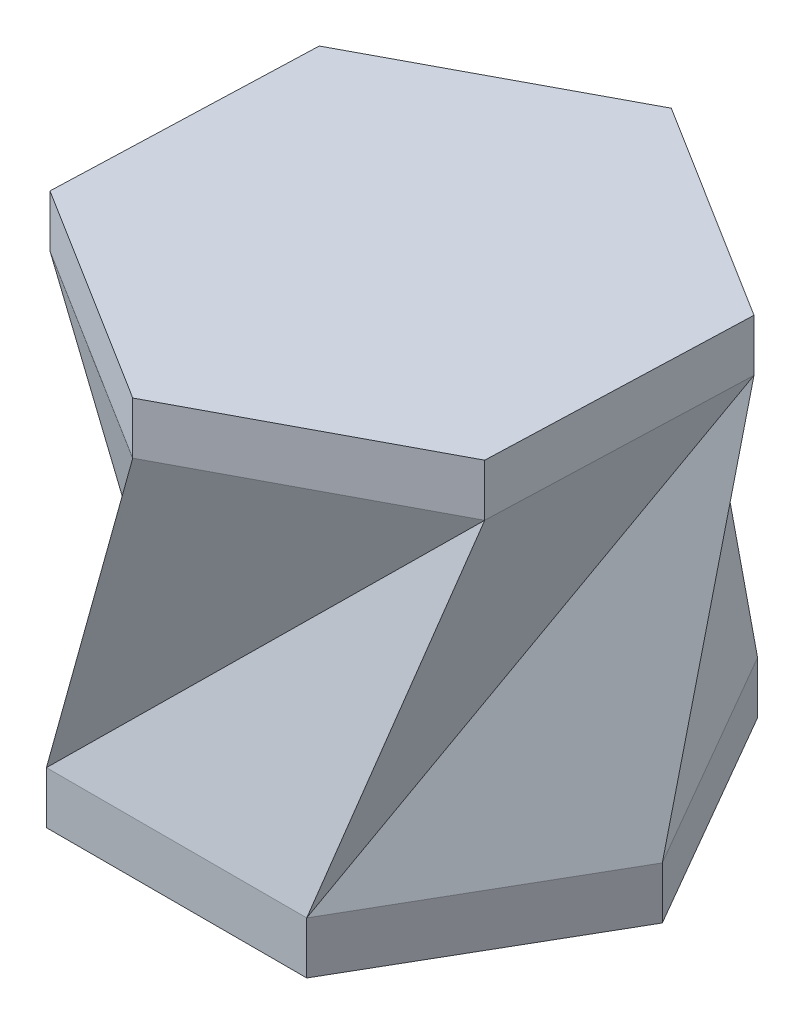
ISO-10303-21;
HEADER;
FILE_DESCRIPTION(('STEP AP214'),'2;1');
FILE_NAME('part.step','',(''),(''),'','','');
FILE_SCHEMA(('AUTOMOTIVE_DESIGN { 1 0 10303 214 1 1 1 1 }'));
ENDSEC;
DATA;
#1=APPLICATION_CONTEXT('core data for automotive mechanical design processes');
#2=APPLICATION_PROTOCOL_DEFINITION('international standard','automotive_design',2000,#1);
#3=PRODUCT_CONTEXT('',#1,'mechanical');
#4=PRODUCT('Part','Part','',(#3));
#5=PRODUCT_RELATED_PRODUCT_CATEGORY('part','',(#4));
#6=PRODUCT_DEFINITION_FORMATION('','',#4);
#7=PRODUCT_DEFINITION_CONTEXT('part definition',#1,'design');
#8=PRODUCT_DEFINITION('design','',#6,#7);
#9=PRODUCT_DEFINITION_SHAPE('','',#8);
#10=(LENGTH_UNIT() NAMED_UNIT(*) SI_UNIT(.MILLI.,.METRE.));
#11=(NAMED_UNIT(*) PLANE_ANGLE_UNIT() SI_UNIT($,.RADIAN.));
#12=(NAMED_UNIT(*) SI_UNIT($,.STERADIAN.) SOLID_ANGLE_UNIT());
#13=UNCERTAINTY_MEASURE_WITH_UNIT(LENGTH_MEASURE(1.E-05),#10,'distance_accuracy_value','');
#14=(GEOMETRIC_REPRESENTATION_CONTEXT(3) GLOBAL_UNCERTAINTY_ASSIGNED_CONTEXT((#13)) GLOBAL_UNIT_ASSIGNED_CONTEXT((#10,
#11,#12)) REPRESENTATION_CONTEXT('',''));
#15=CARTESIAN_POINT('',(0.,0.,0.));
#16=DIRECTION('',(0.,0.,1.));
#17=DIRECTION('',(1.,0.,0.));
#18=AXIS2_PLACEMENT_3D('',#15,#16,#17);
#19=CARTESIAN_POINT('',(0.806507787128734,-0.384671283544788,-1.2902257603011));
#20=DIRECTION('',(0.513885923203171,-0.245102602639358,-0.82209851727943));
#21=DIRECTION('',(-0.122622151561335,-0.969461310102613,0.212387796637649));
#22=AXIS2_PLACEMENT_3D('',#19,#20,#21);
#23=PLANE('',#22);
#24=DIRECTION('',(-0.501925550817948,0.691256268371221,-0.519841815241516));
#25=VECTOR('',#24,1.);
#26=CARTESIAN_POINT('',(2.97562363765975,1.73479591629289,-0.56623567640525));
#27=LINE('',#26,#25);
#28=CARTESIAN_POINT('',(3.5091636023578,1.,-0.0136509687717265));
#29=VERTEX_POINT('',#28);
#30=CARTESIAN_POINT('',(0.136668190487458,5.64463024388675,-3.50652781862201));
#31=VERTEX_POINT('',#30);
#32=EDGE_CURVE('E308',#29,#31,#27,.T.);
#33=ORIENTED_EDGE('',*,*,#32,.F.);
#34=DIRECTION('',(0.847963835182122,0.,0.53005408613011));
#35=VECTOR('',#34,1.);
#36=CARTESIAN_POINT('',(0.992060906898946,1.,-1.58706779809974));
#37=LINE('',#36,#35);
#38=CARTESIAN_POINT('',(3.52074625044103,1.,-0.006410766194687));
#39=VERTEX_POINT('',#38);
#40=EDGE_CURVE('E364',#29,#39,#37,.T.);
#41=ORIENTED_EDGE('',*,*,#40,.T.);
#42=DIRECTION('',(0.0827157803834239,-0.939692620785909,0.331867259783293));
#43=VECTOR('',#42,1.);
#44=CARTESIAN_POINT('',(3.57456104373587,0.388637042244242,0.209501698195769));
#45=LINE('',#44,#43);
#46=CARTESIAN_POINT('',(3.11190594807254,5.64463024388675,-1.64673514211259));
#47=VERTEX_POINT('',#46);
#48=EDGE_CURVE('E312',#47,#39,#45,.T.);
#49=ORIENTED_EDGE('',*,*,#48,.F.);
#50=DIRECTION('',(-0.847963835182122,0.,-0.53005408613011));
#51=VECTOR('',#50,1.);
#52=CARTESIAN_POINT('',(1.61446540258977,5.64463024388675,-2.58277091031203));
#53=LINE('',#52,#51);
#54=EDGE_CURVE('E315',#47,#31,#53,.T.);
#55=ORIENTED_EDGE('',*,*,#54,.T.);
#56=EDGE_LOOP('',(#33,#41,#49,#55));
#57=FACE_BOUND('',#56,.T.);
#58=ADVANCED_FACE('F46',(#57),#23,.F.);
#59=CARTESIAN_POINT('',(-0.714114391473485,-0.384671283544788,-1.34356911215401));
#60=DIRECTION('',(-0.455015238775923,-0.245102602639358,-0.856087522780879));
#61=DIRECTION('',(0.12262215156134,-0.969461310102613,0.212387796637646));
#62=AXIS2_PLACEMENT_3D('',#59,#60,#61);
#63=PLANE('',#62);
#64=DIRECTION('',(-0.701158993357543,0.691256268371221,0.174759370196083));
#65=VECTOR('',#64,1.);
#66=CARTESIAN_POINT('',(0.997437338533854,1.73479591629289,-2.86008350051743));
#67=LINE('',#66,#65);
#68=CARTESIAN_POINT('',(1.74275971543631,1.,-3.04585031006344));
#69=VERTEX_POINT('',#68);
#70=CARTESIAN_POINT('',(-2.96840807475977,5.64463024388675,-1.87162203416239));
#71=VERTEX_POINT('',#70);
#72=EDGE_CURVE('E319',#69,#71,#67,.T.);
#73=ORIENTED_EDGE('',*,*,#72,.F.);
#74=DIRECTION('',(0.88302222155948,0.,-0.469331179693146));
#75=VECTOR('',#74,1.);
#76=CARTESIAN_POINT('',(-0.87841057723314,1.,-1.65268384652579));
#77=LINE('',#76,#75);
#78=CARTESIAN_POINT('',(1.75482123883817,1.,-3.05226107625808));
#79=VERTEX_POINT('',#78);
#80=EDGE_CURVE('E370',#69,#79,#77,.T.);
#81=ORIENTED_EDGE('',*,*,#80,.T.);
#82=DIRECTION('',(0.328763367848375,-0.939692620785908,0.094299662785745));
#83=VECTOR('',#82,1.);
#84=CARTESIAN_POINT('',(1.96871431464143,0.388637042244244,-2.9909098221556));
#85=LINE('',#84,#83);
#86=CARTESIAN_POINT('',(0.129838507662165,5.64463024388675,-3.518357176275));
#87=VERTEX_POINT('',#86);
#88=EDGE_CURVE('E311',#87,#79,#85,.T.);
#89=ORIENTED_EDGE('',*,*,#88,.F.);
#90=DIRECTION('',(-0.88302222155948,0.,0.469331179693146));
#91=VECTOR('',#90,1.);
#92=CARTESIAN_POINT('',(-1.4295125191908,5.64463024388675,-2.68955350732983));
#93=LINE('',#92,#91);
#94=EDGE_CURVE('E223',#87,#71,#93,.T.);
#95=ORIENTED_EDGE('',*,*,#94,.T.);
#96=EDGE_LOOP('',(#73,#81,#89,#95));
#97=FACE_BOUND('',#96,.T.);
#98=ADVANCED_FACE('F383',(#97),#63,.F.);
#99=CARTESIAN_POINT('',(0.714114391473475,-0.384671283544788,1.34356911215401));
#100=DIRECTION('',(0.455015238775917,-0.245102602639358,0.856087522780883));
#101=DIRECTION('',(-0.122622151561338,-0.969461310102613,-0.212387796637647));
#102=AXIS2_PLACEMENT_3D('',#99,#100,#101);
#103=PLANE('',#102);
#104=DIRECTION('',(0.701158993357544,0.691256268371221,-0.174759370196078));
#105=VECTOR('',#104,1.);
#106=CARTESIAN_POINT('',(-0.997437338533875,1.73479591629289,2.86008350051742));
#107=LINE('',#106,#105);
#108=CARTESIAN_POINT('',(-1.74275971543633,1.,3.04585031006342));
#109=VERTEX_POINT('',#108);
#110=CARTESIAN_POINT('',(2.96840807475976,5.64463024388675,1.87162203416241));
#111=VERTEX_POINT('',#110);
#112=EDGE_CURVE('E197',#109,#111,#107,.T.);
#113=ORIENTED_EDGE('',*,*,#112,.F.);
#114=DIRECTION('',(-0.883022221559484,0.,0.46933117969314));
#115=VECTOR('',#114,1.);
#116=CARTESIAN_POINT('',(0.878410577233129,1.,1.65268384652579));
#117=LINE('',#116,#115);
#118=CARTESIAN_POINT('',(-1.75482123883819,1.,3.05226107625807));
#119=VERTEX_POINT('',#118);
#120=EDGE_CURVE('E183',#109,#119,#117,.T.);
#121=ORIENTED_EDGE('',*,*,#120,.T.);
#122=DIRECTION('',(-0.328763367848374,-0.939692620785908,-0.0942996627857473));
#123=VECTOR('',#122,1.);
#124=CARTESIAN_POINT('',(-1.96871431464146,0.388637042244244,2.99090982215558));
#125=LINE('',#124,#123);
#126=CARTESIAN_POINT('',(-0.12983850766219,5.64463024388675,3.518357176275));
#127=VERTEX_POINT('',#126);
#128=EDGE_CURVE('E322',#127,#119,#125,.T.);
#129=ORIENTED_EDGE('',*,*,#128,.F.);
#130=DIRECTION('',(0.883022221559484,0.,-0.46933117969314));
#131=VECTOR('',#130,1.);
#132=CARTESIAN_POINT('',(1.42951251919078,5.64463024388675,2.68955350732984));
#133=LINE('',#132,#131);
#134=EDGE_CURVE('E327',#127,#111,#133,.T.);
#135=ORIENTED_EDGE('',*,*,#134,.T.);
#136=EDGE_LOOP('',(#113,#121,#129,#135));
#137=FACE_BOUND('',#136,.T.);
#138=ADVANCED_FACE('F381',(#137),#103,.F.);
#139=CARTESIAN_POINT('',(1.52062217860222,-0.384671283544788,0.0533433518529181));
#140=DIRECTION('',(0.968901161979092,-0.245102602639358,0.0339890055014594));
#141=DIRECTION('',(-0.245244303122675,-0.969461310102613,0.));
#142=AXIS2_PLACEMENT_3D('',#139,#140,#141);
#143=PLANE('',#142);
#144=DIRECTION('',(0.199233442539602,0.691256268371221,-0.694601185437596));
#145=VECTOR('',#144,1.);
#146=CARTESIAN_POINT('',(1.97818629912586,1.73479591629289,2.29384782411219));
#147=LINE('',#146,#145);
#148=CARTESIAN_POINT('',(1.76640388692145,1.,3.03219934129172));
#149=VERTEX_POINT('',#148);
#150=CARTESIAN_POINT('',(3.10507626524724,5.64463024388675,-1.63490578445959));
#151=VERTEX_POINT('',#150);
#152=EDGE_CURVE('E201',#149,#151,#147,.T.);
#153=ORIENTED_EDGE('',*,*,#152,.F.);
#154=DIRECTION('',(-0.0350583863773682,0.,0.999385265823254));
#155=VECTOR('',#154,1.);
#156=CARTESIAN_POINT('',(1.87047148413208,1.,0.0656160484260624));
#157=LINE('',#156,#155);
#158=CARTESIAN_POINT('',(1.76592501160281,1.,3.04585031006339));
#159=VERTEX_POINT('',#158);
#160=EDGE_CURVE('E180',#149,#159,#157,.T.);
#161=ORIENTED_EDGE('',*,*,#160,.T.);
#162=DIRECTION('',(-0.246047587464951,-0.939692620785908,0.237567596997547));
#163=VECTOR('',#162,1.);
#164=CARTESIAN_POINT('',(1.60584672909439,0.388637042244246,3.20041152035136));
#165=LINE('',#164,#163);
#166=CARTESIAN_POINT('',(2.98206744041033,5.64463024388675,1.87162203416241));
#167=VERTEX_POINT('',#166);
#168=EDGE_CURVE('E191',#167,#159,#165,.T.);
#169=ORIENTED_EDGE('',*,*,#168,.F.);
#170=DIRECTION('',(0.0350583863773682,0.,-0.999385265823254));
#171=VECTOR('',#170,1.);
#172=CARTESIAN_POINT('',(3.04397792178056,5.64463024388675,0.10678259701783));
#173=LINE('',#172,#171);
#174=EDGE_CURVE('E318',#167,#151,#173,.T.);
#175=ORIENTED_EDGE('',*,*,#174,.T.);
#176=EDGE_LOOP('',(#153,#161,#169,#175));
#177=FACE_BOUND('',#176,.T.);
#178=ADVANCED_FACE('F199',(#177),#143,.F.);
#179=CARTESIAN_POINT('',(0.,5.64463024388675,0.));
#180=DIRECTION('',(0.,1.,0.));
#181=DIRECTION('',(0.,0.,1.));
#182=AXIS2_PLACEMENT_3D('',#179,#180,#181);
#183=PLANE('',#182);
#184=ORIENTED_EDGE('',*,*,#94,.F.);
#185=DIRECTION('',(-0.500000000000013,0.,-0.866025403784431));
#186=VECTOR('',#185,1.);
#187=CARTESIAN_POINT('',(1.62087222786737,5.64463024388675,-0.935811017081246));
#188=LINE('',#187,#186);
#189=EDGE_CURVE('E357',#31,#87,#188,.T.);
#190=ORIENTED_EDGE('',*,*,#189,.F.);
#191=ORIENTED_EDGE('',*,*,#54,.F.);
#192=DIRECTION('',(0.499999999999995,0.,-0.866025403784442));
#193=VECTOR('',#192,1.);
#194=CARTESIAN_POINT('',(1.62087222786739,5.64463024388675,0.935811017081212));
#195=LINE('',#194,#193);
#196=EDGE_CURVE('E360',#151,#47,#195,.T.);
#197=ORIENTED_EDGE('',*,*,#196,.F.);
#198=ORIENTED_EDGE('',*,*,#174,.F.);
#199=DIRECTION('',(1.,0.,0.));
#200=VECTOR('',#199,1.);
#201=CARTESIAN_POINT('',(0.,5.64463024388675,1.87162203416244));
#202=LINE('',#201,#200);
#203=EDGE_CURVE('E193',#111,#167,#202,.T.);
#204=ORIENTED_EDGE('',*,*,#203,.F.);
#205=ORIENTED_EDGE('',*,*,#134,.F.);
#206=DIRECTION('',(0.500000000000007,0.,0.866025403784435));
#207=VECTOR('',#206,1.);
#208=CARTESIAN_POINT('',(-1.62087222786737,5.64463024388675,0.935811017081235));
#209=LINE('',#208,#207);
#210=CARTESIAN_POINT('',(-0.136668190487485,5.64463024388675,3.50652781862201));
#211=VERTEX_POINT('',#210);
#212=EDGE_CURVE('E207',#211,#127,#209,.T.);
#213=ORIENTED_EDGE('',*,*,#212,.F.);
#214=DIRECTION('',(0.847963835182119,0.,0.530054086130116));
#215=VECTOR('',#214,1.);
#216=CARTESIAN_POINT('',(-1.61446540258979,5.64463024388675,2.58277091031202));
#217=LINE('',#216,#215);
#218=CARTESIAN_POINT('',(-3.11190594807253,5.64463024388675,1.64673514211258));
#219=VERTEX_POINT('',#218);
#220=EDGE_CURVE('E331',#219,#211,#217,.T.);
#221=ORIENTED_EDGE('',*,*,#220,.F.);
#222=DIRECTION('',(-0.499999999999995,0.,0.866025403784442));
#223=VECTOR('',#222,1.);
#224=CARTESIAN_POINT('',(-1.62087222786739,5.64463024388675,-0.935811017081212));
#225=LINE('',#224,#223);
#226=CARTESIAN_POINT('',(-3.10507626524724,5.64463024388675,1.63490578445959));
#227=VERTEX_POINT('',#226);
#228=EDGE_CURVE('E203',#227,#219,#225,.T.);
#229=ORIENTED_EDGE('',*,*,#228,.F.);
#230=DIRECTION('',(-0.0350583863773682,0.,0.999385265823254));
#231=VECTOR('',#230,1.);
#232=CARTESIAN_POINT('',(-3.04397792178056,5.64463024388675,-0.10678259701783));
#233=LINE('',#232,#231);
#234=CARTESIAN_POINT('',(-2.98206744041033,5.64463024388675,-1.87162203416239));
#235=VERTEX_POINT('',#234);
#236=EDGE_CURVE('E336',#235,#227,#233,.T.);
#237=ORIENTED_EDGE('',*,*,#236,.F.);
#238=DIRECTION('',(-1.,0.,0.));
#239=VECTOR('',#238,1.);
#240=CARTESIAN_POINT('',(0.,5.64463024388675,-1.87162203416244));
#241=LINE('',#240,#239);
#242=EDGE_CURVE('E367',#71,#235,#241,.T.);
#243=ORIENTED_EDGE('',*,*,#242,.F.);
#244=EDGE_LOOP('',(#184,#190,#191,#197,#198,#204,#205,#213,#221,#229,#237,#243));
#245=FACE_BOUND('',#244,.T.);
#246=ADVANCED_FACE('F378',(#245),#183,.F.);
#247=CARTESIAN_POINT('',(2.68510852169906,0.78384934461839,1.55024812780629));
#248=DIRECTION('',(0.839609156473752,0.245102602639355,0.484748572504189));
#249=DIRECTION('',(0.499999999999995,0.,-0.866025403784442));
#250=AXIS2_PLACEMENT_3D('',#247,#248,#249);
#251=PLANE('',#250);
#252=ORIENTED_EDGE('',*,*,#152,.T.);
#253=ORIENTED_EDGE('',*,*,#196,.T.);
#254=ORIENTED_EDGE('',*,*,#48,.T.);
#255=DIRECTION('',(0.499999999999995,0.,-0.866025403784442));
#256=VECTOR('',#255,1.);
#257=CARTESIAN_POINT('',(2.63778374463963,1.,1.52292515503169));
#258=LINE('',#257,#256);
#259=EDGE_CURVE('E334',#149,#39,#258,.T.);
#260=ORIENTED_EDGE('',*,*,#259,.F.);
#261=EDGE_LOOP('',(#252,#253,#254,#260));
#262=FACE_BOUND('',#261,.T.);
#263=ADVANCED_FACE('F626',(#262),#251,.F.);
#264=CARTESIAN_POINT('',(2.68510852169902,0.78384934461839,-1.55024812780634));
#265=DIRECTION('',(0.839609156473742,0.245102602639355,-0.484748572504207));
#266=DIRECTION('',(-0.500000000000013,0.,-0.866025403784431));
#267=AXIS2_PLACEMENT_3D('',#264,#265,#266);
#268=PLANE('',#267);
#269=ORIENTED_EDGE('',*,*,#32,.T.);
#270=ORIENTED_EDGE('',*,*,#189,.T.);
#271=ORIENTED_EDGE('',*,*,#88,.T.);
#272=DIRECTION('',(-0.500000000000013,0.,-0.866025403784431));
#273=VECTOR('',#272,1.);
#274=CARTESIAN_POINT('',(2.63778374463959,1.,-1.52292515503174));
#275=LINE('',#274,#273);
#276=EDGE_CURVE('E343',#29,#79,#275,.T.);
#277=ORIENTED_EDGE('',*,*,#276,.F.);
#278=EDGE_LOOP('',(#269,#270,#271,#277));
#279=FACE_BOUND('',#278,.T.);
#280=ADVANCED_FACE('F622',(#279),#268,.F.);
#281=CARTESIAN_POINT('',(0.,0.78384934461839,-3.10049625561261));
#282=DIRECTION('',(0.,0.245102602639355,-0.969497145008388));
#283=DIRECTION('',(-1.,0.,0.));
#284=AXIS2_PLACEMENT_3D('',#281,#282,#283);
#285=PLANE('',#284);
#286=ORIENTED_EDGE('',*,*,#72,.T.);
#287=ORIENTED_EDGE('',*,*,#242,.T.);
#288=DIRECTION('',(-0.246047587464951,0.939692620785908,0.237567596997548));
#289=VECTOR('',#288,1.);
#290=CARTESIAN_POINT('',(-1.60584672909439,0.388637042244249,-3.20041152035135));
#291=LINE('',#290,#289);
#292=CARTESIAN_POINT('',(-1.76592501160281,1.,-3.04585031006337));
#293=VERTEX_POINT('',#292);
#294=EDGE_CURVE('E196',#293,#235,#291,.T.);
#295=ORIENTED_EDGE('',*,*,#294,.F.);
#296=DIRECTION('',(-1.,0.,0.));
#297=VECTOR('',#296,1.);
#298=CARTESIAN_POINT('',(0.,1.,-3.04585031006341));
#299=LINE('',#298,#297);
#300=EDGE_CURVE('E345',#69,#293,#299,.T.);
#301=ORIENTED_EDGE('',*,*,#300,.F.);
#302=EDGE_LOOP('',(#286,#287,#295,#301));
#303=FACE_BOUND('',#302,.T.);
#304=ADVANCED_FACE('F630',(#303),#285,.F.);
#305=CARTESIAN_POINT('',(-2.68510852169904,0.78384934461839,1.55024812780633));
#306=DIRECTION('',(-0.839609156473745,0.245102602639355,0.484748572504201));
#307=DIRECTION('',(0.500000000000007,0.,0.866025403784435));
#308=AXIS2_PLACEMENT_3D('',#305,#306,#307);
#309=PLANE('',#308);
#310=DIRECTION('',(-0.501925550817944,-0.691256268371221,-0.51984181524152));
#311=VECTOR('',#310,1.);
#312=CARTESIAN_POINT('',(-2.97562363765975,1.7347959162929,0.566235676405229));
#313=LINE('',#312,#311);
#314=CARTESIAN_POINT('',(-3.5091636023578,1.,0.0136509687717015));
#315=VERTEX_POINT('',#314);
#316=EDGE_CURVE('E335',#211,#315,#313,.T.);
#317=ORIENTED_EDGE('',*,*,#316,.F.);
#318=ORIENTED_EDGE('',*,*,#212,.T.);
#319=ORIENTED_EDGE('',*,*,#128,.T.);
#320=DIRECTION('',(0.500000000000007,0.,0.866025403784435));
#321=VECTOR('',#320,1.);
#322=CARTESIAN_POINT('',(-2.63778374463961,1.,1.52292515503172));
#323=LINE('',#322,#321);
#324=EDGE_CURVE('E172',#315,#119,#323,.T.);
#325=ORIENTED_EDGE('',*,*,#324,.F.);
#326=EDGE_LOOP('',(#317,#318,#319,#325));
#327=FACE_BOUND('',#326,.T.);
#328=ADVANCED_FACE('F375',(#327),#309,.F.);
#329=CARTESIAN_POINT('',(0.,0.78384934461839,3.10049625561261));
#330=DIRECTION('',(0.,0.245102602639355,0.969497145008388));
#331=DIRECTION('',(1.,0.,0.));
#332=AXIS2_PLACEMENT_3D('',#329,#330,#331);
#333=PLANE('',#332);
#334=ORIENTED_EDGE('',*,*,#112,.T.);
#335=ORIENTED_EDGE('',*,*,#203,.T.);
#336=ORIENTED_EDGE('',*,*,#168,.T.);
#337=DIRECTION('',(1.,0.,0.));
#338=VECTOR('',#337,1.);
#339=CARTESIAN_POINT('',(0.,1.,3.04585031006341));
#340=LINE('',#339,#338);
#341=EDGE_CURVE('E176',#109,#159,#340,.T.);
#342=ORIENTED_EDGE('',*,*,#341,.F.);
#343=EDGE_LOOP('',(#334,#335,#336,#342));
#344=FACE_BOUND('',#343,.T.);
#345=ADVANCED_FACE('F192',(#344),#333,.F.);
#346=CARTESIAN_POINT('',(-1.52062217860222,-0.384671283544788,-0.0533433518529181));
#347=DIRECTION('',(-0.968901161979092,-0.245102602639358,-0.0339890055014594));
#348=DIRECTION('',(0.245244303122675,-0.969461310102613,0.));
#349=AXIS2_PLACEMENT_3D('',#346,#347,#348);
#350=PLANE('',#349);
#351=DIRECTION('',(-0.199233442539602,0.691256268371221,0.694601185437596));
#352=VECTOR('',#351,1.);
#353=CARTESIAN_POINT('',(-1.97818629912586,1.73479591629289,-2.29384782411219));
#354=LINE('',#353,#352);
#355=CARTESIAN_POINT('',(-1.76640388692145,1.,-3.03219934129172));
#356=VERTEX_POINT('',#355);
#357=EDGE_CURVE('E187',#356,#227,#354,.T.);
#358=ORIENTED_EDGE('',*,*,#357,.F.);
#359=DIRECTION('',(0.0350583863773682,0.,-0.999385265823254));
#360=VECTOR('',#359,1.);
#361=CARTESIAN_POINT('',(-1.87047148413208,1.,-0.0656160484260624));
#362=LINE('',#361,#360);
#363=EDGE_CURVE('E56',#356,#293,#362,.T.);
#364=ORIENTED_EDGE('',*,*,#363,.T.);
#365=ORIENTED_EDGE('',*,*,#294,.T.);
#366=ORIENTED_EDGE('',*,*,#236,.T.);
#367=EDGE_LOOP('',(#358,#364,#365,#366));
#368=FACE_BOUND('',#367,.T.);
#369=ADVANCED_FACE('F633',(#368),#350,.F.);
#370=CARTESIAN_POINT('',(-0.806507787128743,-0.384671283544788,1.2902257603011));
#371=DIRECTION('',(-0.513885923203177,-0.245102602639358,0.822098517279427));
#372=DIRECTION('',(0.122622151561337,-0.969461310102613,-0.212387796637648));
#373=AXIS2_PLACEMENT_3D('',#370,#371,#372);
#374=PLANE('',#373);
#375=ORIENTED_EDGE('',*,*,#316,.T.);
#376=DIRECTION('',(-0.847963835182119,0.,-0.530054086130116));
#377=VECTOR('',#376,1.);
#378=CARTESIAN_POINT('',(-0.992060906898957,1.,1.58706779809974));
#379=LINE('',#378,#377);
#380=CARTESIAN_POINT('',(-3.52074625044102,1.,0.00641076619466922));
#381=VERTEX_POINT('',#380);
#382=EDGE_CURVE('E11',#315,#381,#379,.T.);
#383=ORIENTED_EDGE('',*,*,#382,.T.);
#384=DIRECTION('',(-0.082715780383423,-0.939692620785908,-0.331867259783294));
#385=VECTOR('',#384,1.);
#386=CARTESIAN_POINT('',(-3.57456104373586,0.388637042244244,-0.209501698195787));
#387=LINE('',#386,#385);
#388=EDGE_CURVE('E351',#219,#381,#387,.T.);
#389=ORIENTED_EDGE('',*,*,#388,.F.);
#390=ORIENTED_EDGE('',*,*,#220,.T.);
#391=EDGE_LOOP('',(#375,#383,#389,#390));
#392=FACE_BOUND('',#391,.T.);
#393=ADVANCED_FACE('F405',(#392),#374,.F.);
#394=CARTESIAN_POINT('',(0.,1.,0.));
#395=DIRECTION('',(0.,1.,0.));
#396=DIRECTION('',(0.,0.,1.));
#397=AXIS2_PLACEMENT_3D('',#394,#395,#396);
#398=PLANE('',#397);
#399=CARTESIAN_POINT('',(0.,1.,0.));
#400=DIRECTION('',(0.,1.,0.));
#401=DIRECTION('',(0.,0.,1.));
#402=AXIS2_PLACEMENT_3D('',#399,#400,#401);
#403=CIRCLE('',#402,1.);
#404=CARTESIAN_POINT('',(0.,1.,1.));
#405=VERTEX_POINT('',#404);
#406=EDGE_CURVE('E50',#405,#405,#403,.T.);
#407=ORIENTED_EDGE('',*,*,#406,.F.);
#408=EDGE_LOOP('',(#407));
#409=FACE_BOUND('',#408,.T.);
#410=ORIENTED_EDGE('',*,*,#259,.T.);
#411=ORIENTED_EDGE('',*,*,#40,.F.);
#412=ORIENTED_EDGE('',*,*,#276,.T.);
#413=ORIENTED_EDGE('',*,*,#80,.F.);
#414=ORIENTED_EDGE('',*,*,#300,.T.);
#415=ORIENTED_EDGE('',*,*,#363,.F.);
#416=DIRECTION('',(0.499999999999995,0.,-0.866025403784442));
#417=VECTOR('',#416,1.);
#418=CARTESIAN_POINT('',(-2.63778374463963,1.,-1.52292515503169));
#419=LINE('',#418,#417);
#420=EDGE_CURVE('E65',#381,#356,#419,.T.);
#421=ORIENTED_EDGE('',*,*,#420,.F.);
#422=ORIENTED_EDGE('',*,*,#382,.F.);
#423=ORIENTED_EDGE('',*,*,#324,.T.);
#424=ORIENTED_EDGE('',*,*,#120,.F.);
#425=ORIENTED_EDGE('',*,*,#341,.T.);
#426=ORIENTED_EDGE('',*,*,#160,.F.);
#427=EDGE_LOOP('',(#410,#411,#412,#413,#414,#415,#421,#422,#423,#424,#425,#426));
#428=FACE_BOUND('',#427,.T.);
#429=ADVANCED_FACE('F178',(#409,#428),#398,.T.);
#430=CARTESIAN_POINT('',(-2.68510852169906,0.78384934461839,-1.55024812780629));
#431=DIRECTION('',(-0.839609156473752,0.245102602639355,-0.484748572504189));
#432=DIRECTION('',(-0.499999999999995,0.,0.866025403784442));
#433=AXIS2_PLACEMENT_3D('',#430,#431,#432);
#434=PLANE('',#433);
#435=ORIENTED_EDGE('',*,*,#357,.T.);
#436=ORIENTED_EDGE('',*,*,#228,.T.);
#437=ORIENTED_EDGE('',*,*,#388,.T.);
#438=ORIENTED_EDGE('',*,*,#420,.T.);
#439=EDGE_LOOP('',(#435,#436,#437,#438));
#440=FACE_BOUND('',#439,.T.);
#441=ADVANCED_FACE('F392',(#440),#434,.F.);
#442=CARTESIAN_POINT('',(0.,4.,0.));
#443=DIRECTION('',(0.,-1.,0.));
#444=DIRECTION('',(0.,0.,-1.));
#445=AXIS2_PLACEMENT_3D('',#442,#443,#444);
#446=CYLINDRICAL_SURFACE('',#445,1.);
#447=ORIENTED_EDGE('',*,*,#406,.T.);
#448=EDGE_LOOP('',(#447));
#449=FACE_BOUND('',#448,.T.);
#450=CARTESIAN_POINT('',(0.,-1.,0.));
#451=DIRECTION('',(0.,-1.,0.));
#452=DIRECTION('',(0.,0.,-1.));
#453=AXIS2_PLACEMENT_3D('',#450,#451,#452);
#454=CIRCLE('',#453,1.);
#455=CARTESIAN_POINT('',(0.,-1.,-1.));
#456=VERTEX_POINT('',#455);
#457=EDGE_CURVE('E801',#456,#456,#454,.T.);
#458=ORIENTED_EDGE('',*,*,#457,.T.);
#459=EDGE_LOOP('',(#458));
#460=FACE_BOUND('',#459,.T.);
#461=ADVANCED_FACE('F394',(#449,#460),#446,.F.);
#462=CARTESIAN_POINT('',(1.32039371033191,-0.629773886184146,-2.11232427758054));
#463=DIRECTION('',(0.513885923203171,-0.245102602639358,-0.82209851727943));
#464=DIRECTION('',(-0.122622151561335,-0.969461310102613,0.212387796637649));
#465=AXIS2_PLACEMENT_3D('',#462,#463,#464);
#466=PLANE('',#465);
#467=DIRECTION('',(-0.501925550817947,0.691256268371221,-0.519841815241516));
#468=VECTOR('',#467,1.);
#469=CARTESIAN_POINT('',(0.175291931886797,6.64463024388675,-4.99692632911627));
#470=LINE('',#469,#468);
#471=CARTESIAN_POINT('',(4.99999999999999,0.,0.));
#472=VERTEX_POINT('',#471);
#473=CARTESIAN_POINT('',(0.17529193188682,6.64463024388675,-4.99692632911627));
#474=VERTEX_POINT('',#473);
#475=EDGE_CURVE('E259',#472,#474,#470,.T.);
#476=ORIENTED_EDGE('',*,*,#475,.T.);
#477=DIRECTION('',(-0.847963835182117,0.,-0.530054086130119));
#478=VECTOR('',#477,1.);
#479=CARTESIAN_POINT('',(4.41511110779743,6.64463024388675,-2.34665589846568));
#480=LINE('',#479,#478);
#481=CARTESIAN_POINT('',(4.41511110779743,6.64463024388675,-2.34665589846568));
#482=VERTEX_POINT('',#481);
#483=EDGE_CURVE('E266',#482,#474,#480,.T.);
#484=ORIENTED_EDGE('',*,*,#483,.F.);
#485=DIRECTION('',(0.0827157803834235,-0.939692620785909,0.331867259783293));
#486=VECTOR('',#485,1.);
#487=CARTESIAN_POINT('',(4.99999999999999,0.,0.));
#488=LINE('',#487,#486);
#489=EDGE_CURVE('E261',#482,#472,#488,.T.);
#490=ORIENTED_EDGE('',*,*,#489,.T.);
#491=EDGE_LOOP('',(#476,#484,#490));
#492=FACE_BOUND('',#491,.T.);
#493=ADVANCED_FACE('F48',(#492),#466,.T.);
#494=CARTESIAN_POINT('',(-1.16912963024941,-0.629773886184146,-2.19965663493489));
#495=DIRECTION('',(-0.455015238775923,-0.245102602639358,-0.856087522780879));
#496=DIRECTION('',(0.12262215156134,-0.969461310102613,0.212387796637646));
#497=AXIS2_PLACEMENT_3D('',#494,#495,#496);
#498=PLANE('',#497);
#499=DIRECTION('',(-0.701158993357543,0.691256268371221,0.174759370196083));
#500=VECTOR('',#499,1.);
#501=CARTESIAN_POINT('',(-4.23981917591062,6.64463024388675,-2.65027043065054));
#502=LINE('',#501,#500);
#503=CARTESIAN_POINT('',(2.49999999999993,0.,-4.33012701892222));
#504=VERTEX_POINT('',#503);
#505=CARTESIAN_POINT('',(-4.23981917591061,6.64463024388675,-2.65027043065056));
#506=VERTEX_POINT('',#505);
#507=EDGE_CURVE('E255',#504,#506,#502,.T.);
#508=ORIENTED_EDGE('',*,*,#507,.T.);
#509=DIRECTION('',(-0.883022221559486,0.,0.469331179693135));
#510=VECTOR('',#509,1.);
#511=CARTESIAN_POINT('',(0.175291931886846,6.64463024388675,-4.99692632911627));
#512=LINE('',#511,#510);
#513=EDGE_CURVE('E269',#474,#506,#512,.T.);
#514=ORIENTED_EDGE('',*,*,#513,.F.);
#515=DIRECTION('',(0.328763367848374,-0.939692620785909,0.0942996627857443));
#516=VECTOR('',#515,1.);
#517=CARTESIAN_POINT('',(2.49999999999993,0.,-4.33012701892223));
#518=LINE('',#517,#516);
#519=EDGE_CURVE('E258',#474,#504,#518,.T.);
#520=ORIENTED_EDGE('',*,*,#519,.T.);
#521=EDGE_LOOP('',(#508,#514,#520));
#522=FACE_BOUND('',#521,.T.);
#523=ADVANCED_FACE('F448',(#522),#498,.T.);
#524=CARTESIAN_POINT('',(1.16912963024939,-0.629773886184146,2.1996566349349));
#525=DIRECTION('',(0.455015238775917,-0.245102602639358,0.856087522780883));
#526=DIRECTION('',(-0.122622151561338,-0.969461310102613,-0.212387796637647));
#527=AXIS2_PLACEMENT_3D('',#524,#525,#526);
#528=PLANE('',#527);
#529=DIRECTION('',(0.701158993357544,0.691256268371221,-0.174759370196078));
#530=VECTOR('',#529,1.);
#531=CARTESIAN_POINT('',(4.2398191759106,6.64463024388675,2.65027043065057));
#532=LINE('',#531,#530);
#533=CARTESIAN_POINT('',(-2.49999999999996,0.,4.33012701892221));
#534=VERTEX_POINT('',#533);
#535=CARTESIAN_POINT('',(4.23981917591059,6.64463024388675,2.65027043065059));
#536=VERTEX_POINT('',#535);
#537=EDGE_CURVE('E248',#534,#536,#532,.T.);
#538=ORIENTED_EDGE('',*,*,#537,.T.);
#539=DIRECTION('',(0.883022221559486,0.,-0.469331179693135));
#540=VECTOR('',#539,1.);
#541=CARTESIAN_POINT('',(-0.175291931886845,6.64463024388675,4.99692632911627));
#542=LINE('',#541,#540);
#543=CARTESIAN_POINT('',(-0.175291931886829,6.64463024388675,4.99692632911627));
#544=VERTEX_POINT('',#543);
#545=EDGE_CURVE('E272',#544,#536,#542,.T.);
#546=ORIENTED_EDGE('',*,*,#545,.F.);
#547=DIRECTION('',(-0.328763367848374,-0.939692620785909,-0.0942996627857466));
#548=VECTOR('',#547,1.);
#549=CARTESIAN_POINT('',(-2.49999999999996,0.,4.33012701892221));
#550=LINE('',#549,#548);
#551=EDGE_CURVE('E251',#544,#534,#550,.T.);
#552=ORIENTED_EDGE('',*,*,#551,.T.);
#553=EDGE_LOOP('',(#538,#546,#552));
#554=FACE_BOUND('',#553,.T.);
#555=ADVANCED_FACE('F445',(#554),#528,.T.);
#556=CARTESIAN_POINT('',(2.48952334058131,-0.629773886184146,0.0873323573543775));
#557=DIRECTION('',(0.968901161979092,-0.245102602639358,0.0339890055014594));
#558=DIRECTION('',(-0.245244303122675,-0.969461310102613,0.));
#559=AXIS2_PLACEMENT_3D('',#556,#557,#558);
#560=PLANE('',#559);
#561=DIRECTION('',(0.199233442539603,0.691256268371221,-0.694601185437596));
#562=VECTOR('',#561,1.);
#563=CARTESIAN_POINT('',(4.41511110779743,6.64463024388675,-2.34665589846568));
#564=LINE('',#563,#562);
#565=CARTESIAN_POINT('',(2.50000000000002,0.,4.33012701892217));
#566=VERTEX_POINT('',#565);
#567=EDGE_CURVE('E264',#566,#482,#564,.T.);
#568=ORIENTED_EDGE('',*,*,#567,.T.);
#569=DIRECTION('',(0.0350583863773684,0.,-0.999385265823254));
#570=VECTOR('',#569,1.);
#571=CARTESIAN_POINT('',(4.23981917591059,6.64463024388675,2.65027043065059));
#572=LINE('',#571,#570);
#573=EDGE_CURVE('E276',#536,#482,#572,.T.);
#574=ORIENTED_EDGE('',*,*,#573,.F.);
#575=DIRECTION('',(-0.246047587464949,-0.939692620785909,0.237567596997547));
#576=VECTOR('',#575,1.);
#577=CARTESIAN_POINT('',(2.50000000000005,0.,4.33012701892216));
#578=LINE('',#577,#576);
#579=EDGE_CURVE('E127',#536,#566,#578,.T.);
#580=ORIENTED_EDGE('',*,*,#579,.T.);
#581=EDGE_LOOP('',(#568,#574,#580));
#582=FACE_BOUND('',#581,.T.);
#583=ADVANCED_FACE('F441',(#582),#560,.T.);
#584=CARTESIAN_POINT('',(3.52471767817281,1.02895194725774,2.03499670031048));
#585=DIRECTION('',(0.839609156473752,0.245102602639355,0.484748572504189));
#586=DIRECTION('',(0.499999999999995,0.,-0.866025403784442));
#587=AXIS2_PLACEMENT_3D('',#584,#585,#586);
#588=PLANE('',#587);
#589=ORIENTED_EDGE('',*,*,#567,.F.);
#590=DIRECTION('',(0.499999999999995,0.,-0.866025403784441));
#591=VECTOR('',#590,1.);
#592=CARTESIAN_POINT('',(2.50000000000005,0.,4.33012701892216));
#593=LINE('',#592,#591);
#594=EDGE_CURVE('E224',#566,#472,#593,.T.);
#595=ORIENTED_EDGE('',*,*,#594,.T.);
#596=ORIENTED_EDGE('',*,*,#489,.F.);
#597=EDGE_LOOP('',(#589,#595,#596));
#598=FACE_BOUND('',#597,.T.);
#599=ADVANCED_FACE('F437',(#598),#588,.T.);
#600=CARTESIAN_POINT('',(3.52471767817277,1.02895194725774,-2.03499670031055));
#601=DIRECTION('',(0.839609156473742,0.245102602639355,-0.484748572504207));
#602=DIRECTION('',(-0.500000000000013,0.,-0.866025403784431));
#603=AXIS2_PLACEMENT_3D('',#600,#601,#602);
#604=PLANE('',#603);
#605=ORIENTED_EDGE('',*,*,#475,.F.);
#606=DIRECTION('',(-0.500000000000001,0.,-0.866025403784438));
#607=VECTOR('',#606,1.);
#608=CARTESIAN_POINT('',(4.99999999999999,0.,0.));
#609=LINE('',#608,#607);
#610=EDGE_CURVE('E227',#472,#504,#609,.T.);
#611=ORIENTED_EDGE('',*,*,#610,.T.);
#612=ORIENTED_EDGE('',*,*,#519,.F.);
#613=EDGE_LOOP('',(#605,#611,#612));
#614=FACE_BOUND('',#613,.T.);
#615=ADVANCED_FACE('F433',(#614),#604,.T.);
#616=CARTESIAN_POINT('',(0.,1.02895194725774,-4.06999340062099));
#617=DIRECTION('',(0.,0.245102602639355,-0.969497145008388));
#618=DIRECTION('',(-1.,0.,0.));
#619=AXIS2_PLACEMENT_3D('',#616,#617,#618);
#620=PLANE('',#619);
#621=ORIENTED_EDGE('',*,*,#507,.F.);
#622=DIRECTION('',(-1.,0.,0.));
#623=VECTOR('',#622,1.);
#624=CARTESIAN_POINT('',(2.49999999999998,0.,-4.33012701892219));
#625=LINE('',#624,#623);
#626=CARTESIAN_POINT('',(-2.50000000000005,0.,-4.33012701892216));
#627=VERTEX_POINT('',#626);
#628=EDGE_CURVE('E231',#504,#627,#625,.T.);
#629=ORIENTED_EDGE('',*,*,#628,.T.);
#630=DIRECTION('',(-0.246047587464951,0.939692620785908,0.237567596997546));
#631=VECTOR('',#630,1.);
#632=CARTESIAN_POINT('',(-2.50000000000002,0.,-4.33012701892217));
#633=LINE('',#632,#631);
#634=EDGE_CURVE('E244',#627,#506,#633,.T.);
#635=ORIENTED_EDGE('',*,*,#634,.T.);
#636=EDGE_LOOP('',(#621,#629,#635));
#637=FACE_BOUND('',#636,.T.);
#638=ADVANCED_FACE('F429',(#637),#620,.T.);
#639=CARTESIAN_POINT('',(-3.52471767817278,1.02895194725774,2.03499670031053));
#640=DIRECTION('',(-0.839609156473745,0.245102602639355,0.484748572504201));
#641=DIRECTION('',(0.500000000000007,0.,0.866025403784435));
#642=AXIS2_PLACEMENT_3D('',#639,#640,#641);
#643=PLANE('',#642);
#644=DIRECTION('',(-0.501925550817944,-0.691256268371221,-0.51984181524152));
#645=VECTOR('',#644,1.);
#646=CARTESIAN_POINT('',(-0.17529193188683,6.64463024388675,4.99692632911627));
#647=LINE('',#646,#645);
#648=CARTESIAN_POINT('',(-4.99999999999999,0.,0.));
#649=VERTEX_POINT('',#648);
#650=EDGE_CURVE('E238',#544,#649,#647,.T.);
#651=ORIENTED_EDGE('',*,*,#650,.T.);
#652=DIRECTION('',(0.500000000000007,0.,0.866025403784434));
#653=VECTOR('',#652,1.);
#654=CARTESIAN_POINT('',(-4.99999999999999,0.,0.));
#655=LINE('',#654,#653);
#656=EDGE_CURVE('E234',#649,#534,#655,.T.);
#657=ORIENTED_EDGE('',*,*,#656,.T.);
#658=ORIENTED_EDGE('',*,*,#551,.F.);
#659=EDGE_LOOP('',(#651,#657,#658));
#660=FACE_BOUND('',#659,.T.);
#661=ADVANCED_FACE('F426',(#660),#643,.T.);
#662=CARTESIAN_POINT('',(0.,1.02895194725774,4.069993400621));
#663=DIRECTION('',(0.,0.245102602639355,0.969497145008388));
#664=DIRECTION('',(1.,0.,0.));
#665=AXIS2_PLACEMENT_3D('',#662,#663,#664);
#666=PLANE('',#665);
#667=ORIENTED_EDGE('',*,*,#537,.F.);
#668=DIRECTION('',(1.,0.,0.));
#669=VECTOR('',#668,1.);
#670=CARTESIAN_POINT('',(-2.49999999999996,0.,4.33012701892221));
#671=LINE('',#670,#669);
#672=EDGE_CURVE('E217',#534,#566,#671,.T.);
#673=ORIENTED_EDGE('',*,*,#672,.T.);
#674=ORIENTED_EDGE('',*,*,#579,.F.);
#675=EDGE_LOOP('',(#667,#673,#674));
#676=FACE_BOUND('',#675,.T.);
#677=ADVANCED_FACE('F422',(#676),#666,.T.);
#678=CARTESIAN_POINT('',(-2.48952334058131,-0.629773886184146,-0.0873323573543775));
#679=DIRECTION('',(-0.968901161979092,-0.245102602639358,-0.0339890055014594));
#680=DIRECTION('',(0.245244303122675,-0.969461310102613,0.));
#681=AXIS2_PLACEMENT_3D('',#678,#679,#680);
#682=PLANE('',#681);
#683=DIRECTION('',(-0.199233442539603,0.691256268371221,0.694601185437596));
#684=VECTOR('',#683,1.);
#685=CARTESIAN_POINT('',(-4.41511110779743,6.64463024388675,2.34665589846568));
#686=LINE('',#685,#684);
#687=CARTESIAN_POINT('',(-4.41511110779743,6.64463024388675,2.34665589846568));
#688=VERTEX_POINT('',#687);
#689=EDGE_CURVE('E213',#627,#688,#686,.T.);
#690=ORIENTED_EDGE('',*,*,#689,.T.);
#691=DIRECTION('',(-0.0350583863773682,0.,0.999385265823253));
#692=VECTOR('',#691,1.);
#693=CARTESIAN_POINT('',(-4.23981917591059,6.64463024388675,-2.6502704306506));
#694=LINE('',#693,#692);
#695=EDGE_CURVE('E241',#506,#688,#694,.T.);
#696=ORIENTED_EDGE('',*,*,#695,.F.);
#697=ORIENTED_EDGE('',*,*,#634,.F.);
#698=EDGE_LOOP('',(#690,#696,#697));
#699=FACE_BOUND('',#698,.T.);
#700=ADVANCED_FACE('F418',(#699),#682,.T.);
#701=CARTESIAN_POINT('',(-1.32039371033192,-0.629773886184146,2.11232427758053));
#702=DIRECTION('',(-0.513885923203177,-0.245102602639358,0.822098517279427));
#703=DIRECTION('',(0.122622151561337,-0.969461310102613,-0.212387796637648));
#704=AXIS2_PLACEMENT_3D('',#701,#702,#703);
#705=PLANE('',#704);
#706=ORIENTED_EDGE('',*,*,#650,.F.);
#707=DIRECTION('',(0.847963835182119,0.,0.530054086130116));
#708=VECTOR('',#707,1.);
#709=CARTESIAN_POINT('',(-4.41511110779743,6.64463024388675,2.34665589846569));
#710=LINE('',#709,#708);
#711=EDGE_CURVE('E228',#688,#544,#710,.T.);
#712=ORIENTED_EDGE('',*,*,#711,.F.);
#713=DIRECTION('',(-0.0827157803834235,-0.939692620785909,-0.331867259783293));
#714=VECTOR('',#713,1.);
#715=CARTESIAN_POINT('',(-4.99999999999999,0.,0.));
#716=LINE('',#715,#714);
#717=EDGE_CURVE('E216',#688,#649,#716,.T.);
#718=ORIENTED_EDGE('',*,*,#717,.T.);
#719=EDGE_LOOP('',(#706,#712,#718));
#720=FACE_BOUND('',#719,.T.);
#721=ADVANCED_FACE('F414',(#720),#705,.T.);
#722=CARTESIAN_POINT('',(-3.52471767817281,1.02895194725774,-2.03499670031048));
#723=DIRECTION('',(-0.839609156473752,0.245102602639355,-0.484748572504189));
#724=DIRECTION('',(-0.499999999999995,0.,0.866025403784442));
#725=AXIS2_PLACEMENT_3D('',#722,#723,#724);
#726=PLANE('',#725);
#727=ORIENTED_EDGE('',*,*,#689,.F.);
#728=DIRECTION('',(0.499999999999995,0.,-0.866025403784442));
#729=VECTOR('',#728,1.);
#730=CARTESIAN_POINT('',(-2.50000000000002,0.,-4.33012701892218));
#731=LINE('',#730,#729);
#732=EDGE_CURVE('E220',#649,#627,#731,.T.);
#733=ORIENTED_EDGE('',*,*,#732,.F.);
#734=ORIENTED_EDGE('',*,*,#717,.F.);
#735=EDGE_LOOP('',(#727,#733,#734));
#736=FACE_BOUND('',#735,.T.);
#737=ADVANCED_FACE('F410',(#736),#726,.T.);
#738=CARTESIAN_POINT('',(-4.23981917591061,7.64463024388675,-2.65027043065056));
#739=DIRECTION('',(0.999385265823254,0.,0.035058386377364));
#740=DIRECTION('',(0.035058386377364,0.,-0.999385265823254));
#741=AXIS2_PLACEMENT_3D('',#738,#739,#740);
#742=PLANE('',#741);
#743=ORIENTED_EDGE('',*,*,#695,.T.);
#744=DIRECTION('',(0.,-1.,0.));
#745=VECTOR('',#744,1.);
#746=CARTESIAN_POINT('',(-4.41511110779743,7.64463024388675,2.34665589846568));
#747=LINE('',#746,#745);
#748=CARTESIAN_POINT('',(-4.41511110779743,7.64463024388675,2.34665589846568));
#749=VERTEX_POINT('',#748);
#750=EDGE_CURVE('E273',#749,#688,#747,.T.);
#751=ORIENTED_EDGE('',*,*,#750,.F.);
#752=DIRECTION('',(-0.035058386377364,0.,0.999385265823254));
#753=VECTOR('',#752,1.);
#754=CARTESIAN_POINT('',(-4.23981917591061,7.64463024388675,-2.65027043065056));
#755=LINE('',#754,#753);
#756=CARTESIAN_POINT('',(-4.23981917591061,7.64463024388675,-2.65027043065056));
#757=VERTEX_POINT('',#756);
#758=EDGE_CURVE('E466',#757,#749,#755,.T.);
#759=ORIENTED_EDGE('',*,*,#758,.F.);
#760=DIRECTION('',(0.,-1.,0.));
#761=VECTOR('',#760,1.);
#762=CARTESIAN_POINT('',(-4.23981917591061,7.64463024388675,-2.65027043065056));
#763=LINE('',#762,#761);
#764=EDGE_CURVE('E294',#757,#506,#763,.T.);
#765=ORIENTED_EDGE('',*,*,#764,.T.);
#766=EDGE_LOOP('',(#743,#751,#759,#765));
#767=FACE_BOUND('',#766,.T.);
#768=ADVANCED_FACE('F413',(#767),#742,.F.);
#769=CARTESIAN_POINT('',(-4.41511110779743,7.64463024388675,2.34665589846568));
#770=DIRECTION('',(0.530054086130117,0.,-0.847963835182118));
#771=DIRECTION('',(-0.847963835182118,0.,-0.530054086130117));
#772=AXIS2_PLACEMENT_3D('',#769,#770,#771);
#773=PLANE('',#772);
#774=ORIENTED_EDGE('',*,*,#711,.T.);
#775=DIRECTION('',(0.,-1.,0.));
#776=VECTOR('',#775,1.);
#777=CARTESIAN_POINT('',(-0.175291931886829,7.64463024388675,4.99692632911627));
#778=LINE('',#777,#776);
#779=CARTESIAN_POINT('',(-0.175291931886829,7.64463024388675,4.99692632911627));
#780=VERTEX_POINT('',#779);
#781=EDGE_CURVE('E303',#780,#544,#778,.T.);
#782=ORIENTED_EDGE('',*,*,#781,.F.);
#783=DIRECTION('',(0.847963835182118,0.,0.530054086130117));
#784=VECTOR('',#783,1.);
#785=CARTESIAN_POINT('',(-4.41511110779743,7.64463024388675,2.34665589846568));
#786=LINE('',#785,#784);
#787=EDGE_CURVE('E468',#749,#780,#786,.T.);
#788=ORIENTED_EDGE('',*,*,#787,.F.);
#789=ORIENTED_EDGE('',*,*,#750,.T.);
#790=EDGE_LOOP('',(#774,#782,#788,#789));
#791=FACE_BOUND('',#790,.T.);
#792=ADVANCED_FACE('F550',(#791),#773,.F.);
#793=CARTESIAN_POINT('',(-0.175291931886829,7.64463024388675,4.99692632911627));
#794=DIRECTION('',(-0.469331179693137,0.,-0.883022221559485));
#795=DIRECTION('',(-0.883022221559485,0.,0.469331179693137));
#796=AXIS2_PLACEMENT_3D('',#793,#794,#795);
#797=PLANE('',#796);
#798=ORIENTED_EDGE('',*,*,#545,.T.);
#799=DIRECTION('',(0.,-1.,0.));
#800=VECTOR('',#799,1.);
#801=CARTESIAN_POINT('',(4.23981917591059,7.64463024388675,2.65027043065059));
#802=LINE('',#801,#800);
#803=CARTESIAN_POINT('',(4.23981917591059,7.64463024388675,2.65027043065059));
#804=VERTEX_POINT('',#803);
#805=EDGE_CURVE('E296',#804,#536,#802,.T.);
#806=ORIENTED_EDGE('',*,*,#805,.F.);
#807=DIRECTION('',(0.883022221559485,0.,-0.469331179693137));
#808=VECTOR('',#807,1.);
#809=CARTESIAN_POINT('',(-0.175291931886829,7.64463024388675,4.99692632911627));
#810=LINE('',#809,#808);
#811=EDGE_CURVE('E471',#780,#804,#810,.T.);
#812=ORIENTED_EDGE('',*,*,#811,.F.);
#813=ORIENTED_EDGE('',*,*,#781,.T.);
#814=EDGE_LOOP('',(#798,#806,#812,#813));
#815=FACE_BOUND('',#814,.T.);
#816=ADVANCED_FACE('F552',(#815),#797,.F.);
#817=CARTESIAN_POINT('',(4.23981917591059,7.64463024388675,2.65027043065059));
#818=DIRECTION('',(-0.999385265823254,0.,-0.0350583863773672));
#819=DIRECTION('',(-0.0350583863773672,0.,0.999385265823254));
#820=AXIS2_PLACEMENT_3D('',#817,#818,#819);
#821=PLANE('',#820);
#822=ORIENTED_EDGE('',*,*,#573,.T.);
#823=DIRECTION('',(0.,-1.,0.));
#824=VECTOR('',#823,1.);
#825=CARTESIAN_POINT('',(4.41511110779743,7.64463024388675,-2.34665589846568));
#826=LINE('',#825,#824);
#827=CARTESIAN_POINT('',(4.41511110779743,7.64463024388675,-2.34665589846568));
#828=VERTEX_POINT('',#827);
#829=EDGE_CURVE('E288',#828,#482,#826,.T.);
#830=ORIENTED_EDGE('',*,*,#829,.F.);
#831=DIRECTION('',(0.0350583863773672,0.,-0.999385265823253));
#832=VECTOR('',#831,1.);
#833=CARTESIAN_POINT('',(4.23981917591059,7.64463024388675,2.65027043065059));
#834=LINE('',#833,#832);
#835=EDGE_CURVE('E480',#804,#828,#834,.T.);
#836=ORIENTED_EDGE('',*,*,#835,.F.);
#837=ORIENTED_EDGE('',*,*,#805,.T.);
#838=EDGE_LOOP('',(#822,#830,#836,#837));
#839=FACE_BOUND('',#838,.T.);
#840=ADVANCED_FACE('F554',(#839),#821,.F.);
#841=CARTESIAN_POINT('',(4.41511110779743,7.64463024388675,-2.34665589846568));
#842=DIRECTION('',(-0.530054086130116,0.,0.847963835182119));
#843=DIRECTION('',(0.847963835182119,0.,0.530054086130116));
#844=AXIS2_PLACEMENT_3D('',#841,#842,#843);
#845=PLANE('',#844);
#846=ORIENTED_EDGE('',*,*,#483,.T.);
#847=DIRECTION('',(0.,-1.,0.));
#848=VECTOR('',#847,1.);
#849=CARTESIAN_POINT('',(0.17529193188682,7.64463024388675,-4.99692632911627));
#850=LINE('',#849,#848);
#851=CARTESIAN_POINT('',(0.17529193188682,7.64463024388675,-4.99692632911627));
#852=VERTEX_POINT('',#851);
#853=EDGE_CURVE('E286',#852,#474,#850,.T.);
#854=ORIENTED_EDGE('',*,*,#853,.F.);
#855=DIRECTION('',(-0.847963835182119,0.,-0.530054086130116));
#856=VECTOR('',#855,1.);
#857=CARTESIAN_POINT('',(4.41511110779743,7.64463024388675,-2.34665589846568));
#858=LINE('',#857,#856);
#859=EDGE_CURVE('E483',#828,#852,#858,.T.);
#860=ORIENTED_EDGE('',*,*,#859,.F.);
#861=ORIENTED_EDGE('',*,*,#829,.T.);
#862=EDGE_LOOP('',(#846,#854,#860,#861));
#863=FACE_BOUND('',#862,.T.);
#864=ADVANCED_FACE('F284',(#863),#845,.F.);
#865=CARTESIAN_POINT('',(0.17529193188682,7.64463024388675,-4.99692632911627));
#866=DIRECTION('',(0.469331179693141,0.,0.883022221559483));
#867=DIRECTION('',(0.883022221559483,0.,-0.469331179693141));
#868=AXIS2_PLACEMENT_3D('',#865,#866,#867);
#869=PLANE('',#868);
#870=ORIENTED_EDGE('',*,*,#513,.T.);
#871=ORIENTED_EDGE('',*,*,#764,.F.);
#872=DIRECTION('',(-0.883022221559483,0.,0.469331179693141));
#873=VECTOR('',#872,1.);
#874=CARTESIAN_POINT('',(0.17529193188682,7.64463024388675,-4.99692632911627));
#875=LINE('',#874,#873);
#876=EDGE_CURVE('E137',#852,#757,#875,.T.);
#877=ORIENTED_EDGE('',*,*,#876,.F.);
#878=ORIENTED_EDGE('',*,*,#853,.T.);
#879=EDGE_LOOP('',(#870,#871,#877,#878));
#880=FACE_BOUND('',#879,.T.);
#881=ADVANCED_FACE('F291',(#880),#869,.F.);
#882=CARTESIAN_POINT('',(0.,7.64463024388675,0.));
#883=DIRECTION('',(0.,1.,0.));
#884=DIRECTION('',(0.,0.,1.));
#885=AXIS2_PLACEMENT_3D('',#882,#883,#884);
#886=PLANE('',#885);
#887=ORIENTED_EDGE('',*,*,#758,.T.);
#888=ORIENTED_EDGE('',*,*,#787,.T.);
#889=ORIENTED_EDGE('',*,*,#811,.T.);
#890=ORIENTED_EDGE('',*,*,#835,.T.);
#891=ORIENTED_EDGE('',*,*,#859,.T.);
#892=ORIENTED_EDGE('',*,*,#876,.T.);
#893=EDGE_LOOP('',(#887,#888,#889,#890,#891,#892));
#894=FACE_BOUND('',#893,.T.);
#895=ADVANCED_FACE('F484',(#894),#886,.T.);
#896=CARTESIAN_POINT('',(2.50000000000002,-1.,4.33012701892217));
#897=DIRECTION('',(0.,0.,-1.));
#898=DIRECTION('',(-1.,0.,0.));
#899=AXIS2_PLACEMENT_3D('',#896,#897,#898);
#900=PLANE('',#899);
#901=ORIENTED_EDGE('',*,*,#672,.F.);
#902=DIRECTION('',(0.,1.,0.));
#903=VECTOR('',#902,1.);
#904=CARTESIAN_POINT('',(-2.49999999999996,-1.,4.33012701892221));
#905=LINE('',#904,#903);
#906=CARTESIAN_POINT('',(-2.49999999999996,-1.,4.33012701892221));
#907=VERTEX_POINT('',#906);
#908=EDGE_CURVE('E469',#907,#534,#905,.T.);
#909=ORIENTED_EDGE('',*,*,#908,.F.);
#910=DIRECTION('',(-1.,0.,0.));
#911=VECTOR('',#910,1.);
#912=CARTESIAN_POINT('',(2.50000000000002,-1.,4.33012701892217));
#913=LINE('',#912,#911);
#914=CARTESIAN_POINT('',(2.50000000000002,-1.,4.33012701892217));
#915=VERTEX_POINT('',#914);
#916=EDGE_CURVE('E532',#915,#907,#913,.T.);
#917=ORIENTED_EDGE('',*,*,#916,.F.);
#918=DIRECTION('',(0.,1.,0.));
#919=VECTOR('',#918,1.);
#920=CARTESIAN_POINT('',(2.50000000000002,-1.,4.33012701892217));
#921=LINE('',#920,#919);
#922=EDGE_CURVE('E543',#915,#566,#921,.T.);
#923=ORIENTED_EDGE('',*,*,#922,.T.);
#924=EDGE_LOOP('',(#901,#909,#917,#923));
#925=FACE_BOUND('',#924,.T.);
#926=ADVANCED_FACE('F542',(#925),#900,.F.);
#927=CARTESIAN_POINT('',(-2.49999999999996,-1.,4.33012701892221));
#928=DIRECTION('',(0.866025403784435,0.,-0.500000000000007));
#929=DIRECTION('',(-0.500000000000007,0.,-0.866025403784434));
#930=AXIS2_PLACEMENT_3D('',#927,#928,#929);
#931=PLANE('',#930);
#932=ORIENTED_EDGE('',*,*,#656,.F.);
#933=DIRECTION('',(0.,1.,0.));
#934=VECTOR('',#933,1.);
#935=CARTESIAN_POINT('',(-4.99999999999999,-1.,0.));
#936=LINE('',#935,#934);
#937=CARTESIAN_POINT('',(-4.99999999999999,-1.,0.));
#938=VERTEX_POINT('',#937);
#939=EDGE_CURVE('E474',#938,#649,#936,.T.);
#940=ORIENTED_EDGE('',*,*,#939,.F.);
#941=DIRECTION('',(-0.500000000000007,0.,-0.866025403784434));
#942=VECTOR('',#941,1.);
#943=CARTESIAN_POINT('',(-2.49999999999996,-1.,4.33012701892221));
#944=LINE('',#943,#942);
#945=EDGE_CURVE('E523',#907,#938,#944,.T.);
#946=ORIENTED_EDGE('',*,*,#945,.F.);
#947=ORIENTED_EDGE('',*,*,#908,.T.);
#948=EDGE_LOOP('',(#932,#940,#946,#947));
#949=FACE_BOUND('',#948,.T.);
#950=ADVANCED_FACE('F525',(#949),#931,.F.);
#951=CARTESIAN_POINT('',(-4.99999999999999,-1.,0.));
#952=DIRECTION('',(0.866025403784443,0.,0.499999999999992));
#953=DIRECTION('',(0.499999999999992,0.,-0.866025403784443));
#954=AXIS2_PLACEMENT_3D('',#951,#952,#953);
#955=PLANE('',#954);
#956=ORIENTED_EDGE('',*,*,#732,.T.);
#957=DIRECTION('',(0.,1.,0.));
#958=VECTOR('',#957,1.);
#959=CARTESIAN_POINT('',(-2.50000000000005,-1.,-4.33012701892216));
#960=LINE('',#959,#958);
#961=CARTESIAN_POINT('',(-2.50000000000005,-1.,-4.33012701892216));
#962=VERTEX_POINT('',#961);
#963=EDGE_CURVE('E569',#962,#627,#960,.T.);
#964=ORIENTED_EDGE('',*,*,#963,.F.);
#965=DIRECTION('',(0.499999999999992,0.,-0.866025403784443));
#966=VECTOR('',#965,1.);
#967=CARTESIAN_POINT('',(-4.99999999999999,-1.,0.));
#968=LINE('',#967,#966);
#969=EDGE_CURVE('E531',#938,#962,#968,.T.);
#970=ORIENTED_EDGE('',*,*,#969,.F.);
#971=ORIENTED_EDGE('',*,*,#939,.T.);
#972=EDGE_LOOP('',(#956,#964,#970,#971));
#973=FACE_BOUND('',#972,.T.);
#974=ADVANCED_FACE('F577',(#973),#955,.F.);
#975=CARTESIAN_POINT('',(-2.50000000000005,-1.,-4.33012701892216));
#976=DIRECTION('',(0.,0.,1.));
#977=DIRECTION('',(1.,0.,0.));
#978=AXIS2_PLACEMENT_3D('',#975,#976,#977);
#979=PLANE('',#978);
#980=ORIENTED_EDGE('',*,*,#628,.F.);
#981=DIRECTION('',(0.,1.,0.));
#982=VECTOR('',#981,1.);
#983=CARTESIAN_POINT('',(2.49999999999993,-1.,-4.33012701892222));
#984=LINE('',#983,#982);
#985=CARTESIAN_POINT('',(2.49999999999993,-1.,-4.33012701892222));
#986=VERTEX_POINT('',#985);
#987=EDGE_CURVE('E565',#986,#504,#984,.T.);
#988=ORIENTED_EDGE('',*,*,#987,.F.);
#989=DIRECTION('',(1.,0.,0.));
#990=VECTOR('',#989,1.);
#991=CARTESIAN_POINT('',(-2.50000000000005,-1.,-4.33012701892216));
#992=LINE('',#991,#990);
#993=EDGE_CURVE('E580',#962,#986,#992,.T.);
#994=ORIENTED_EDGE('',*,*,#993,.F.);
#995=ORIENTED_EDGE('',*,*,#963,.T.);
#996=EDGE_LOOP('',(#980,#988,#994,#995));
#997=FACE_BOUND('',#996,.T.);
#998=ADVANCED_FACE('F586',(#997),#979,.F.);
#999=CARTESIAN_POINT('',(2.49999999999993,-1.,-4.33012701892222));
#1000=DIRECTION('',(-0.866025403784432,0.,0.500000000000011));
#1001=DIRECTION('',(0.500000000000011,0.,0.866025403784433));
#1002=AXIS2_PLACEMENT_3D('',#999,#1000,#1001);
#1003=PLANE('',#1002);
#1004=ORIENTED_EDGE('',*,*,#610,.F.);
#1005=DIRECTION('',(0.,1.,0.));
#1006=VECTOR('',#1005,1.);
#1007=CARTESIAN_POINT('',(4.99999999999999,-1.,0.));
#1008=LINE('',#1007,#1006);
#1009=CARTESIAN_POINT('',(4.99999999999999,-1.,0.));
#1010=VERTEX_POINT('',#1009);
#1011=EDGE_CURVE('E563',#1010,#472,#1008,.T.);
#1012=ORIENTED_EDGE('',*,*,#1011,.F.);
#1013=DIRECTION('',(0.500000000000011,0.,0.866025403784432));
#1014=VECTOR('',#1013,1.);
#1015=CARTESIAN_POINT('',(2.49999999999993,-1.,-4.33012701892222));
#1016=LINE('',#1015,#1014);
#1017=EDGE_CURVE('E582',#986,#1010,#1016,.T.);
#1018=ORIENTED_EDGE('',*,*,#1017,.F.);
#1019=ORIENTED_EDGE('',*,*,#987,.T.);
#1020=EDGE_LOOP('',(#1004,#1012,#1018,#1019));
#1021=FACE_BOUND('',#1020,.T.);
#1022=ADVANCED_FACE('F561',(#1021),#1003,.F.);
#1023=CARTESIAN_POINT('',(4.99999999999999,-1.,0.));
#1024=DIRECTION('',(-0.866025403784443,0.,-0.499999999999993));
#1025=DIRECTION('',(-0.499999999999993,0.,0.866025403784443));
#1026=AXIS2_PLACEMENT_3D('',#1023,#1024,#1025);
#1027=PLANE('',#1026);
#1028=ORIENTED_EDGE('',*,*,#594,.F.);
#1029=ORIENTED_EDGE('',*,*,#922,.F.);
#1030=DIRECTION('',(-0.499999999999993,0.,0.866025403784443));
#1031=VECTOR('',#1030,1.);
#1032=CARTESIAN_POINT('',(4.99999999999999,-1.,0.));
#1033=LINE('',#1032,#1031);
#1034=EDGE_CURVE('E537',#1010,#915,#1033,.T.);
#1035=ORIENTED_EDGE('',*,*,#1034,.F.);
#1036=ORIENTED_EDGE('',*,*,#1011,.T.);
#1037=EDGE_LOOP('',(#1028,#1029,#1035,#1036));
#1038=FACE_BOUND('',#1037,.T.);
#1039=ADVANCED_FACE('F567',(#1038),#1027,.F.);
#1040=CARTESIAN_POINT('',(0.,-1.,0.));
#1041=DIRECTION('',(0.,-1.,0.));
#1042=DIRECTION('',(0.,0.,-1.));
#1043=AXIS2_PLACEMENT_3D('',#1040,#1041,#1042);
#1044=PLANE('',#1043);
#1045=ORIENTED_EDGE('',*,*,#457,.F.);
#1046=EDGE_LOOP('',(#1045));
#1047=FACE_BOUND('',#1046,.T.);
#1048=ORIENTED_EDGE('',*,*,#916,.T.);
#1049=ORIENTED_EDGE('',*,*,#945,.T.);
#1050=ORIENTED_EDGE('',*,*,#969,.T.);
#1051=ORIENTED_EDGE('',*,*,#993,.T.);
#1052=ORIENTED_EDGE('',*,*,#1017,.T.);
#1053=ORIENTED_EDGE('',*,*,#1034,.T.);
#1054=EDGE_LOOP('',(#1048,#1049,#1050,#1051,#1052,#1053));
#1055=FACE_BOUND('',#1054,.T.);
#1056=ADVANCED_FACE('F535',(#1047,#1055),#1044,.T.);
#1057=CLOSED_SHELL('',(#58,#98,#138,#178,#246,#263,#280,#304,#328,#345,#369,#393,#429,#441,#461,
#493,#523,#555,#583,#599,#615,#638,#661,#677,#700,#721,#737,#768,#792,#816,#840,#864,#881,#895,
#926,#950,#974,#998,#1022,#1039,#1056));
#1058=MANIFOLD_SOLID_BREP('B2',#1057);
#1059=ADVANCED_BREP_SHAPE_REPRESENTATION('',(#18,#1058),#14);
#1060=SHAPE_DEFINITION_REPRESENTATION(#9,#1059);
ENDSEC;
END-ISO-10303-21;
